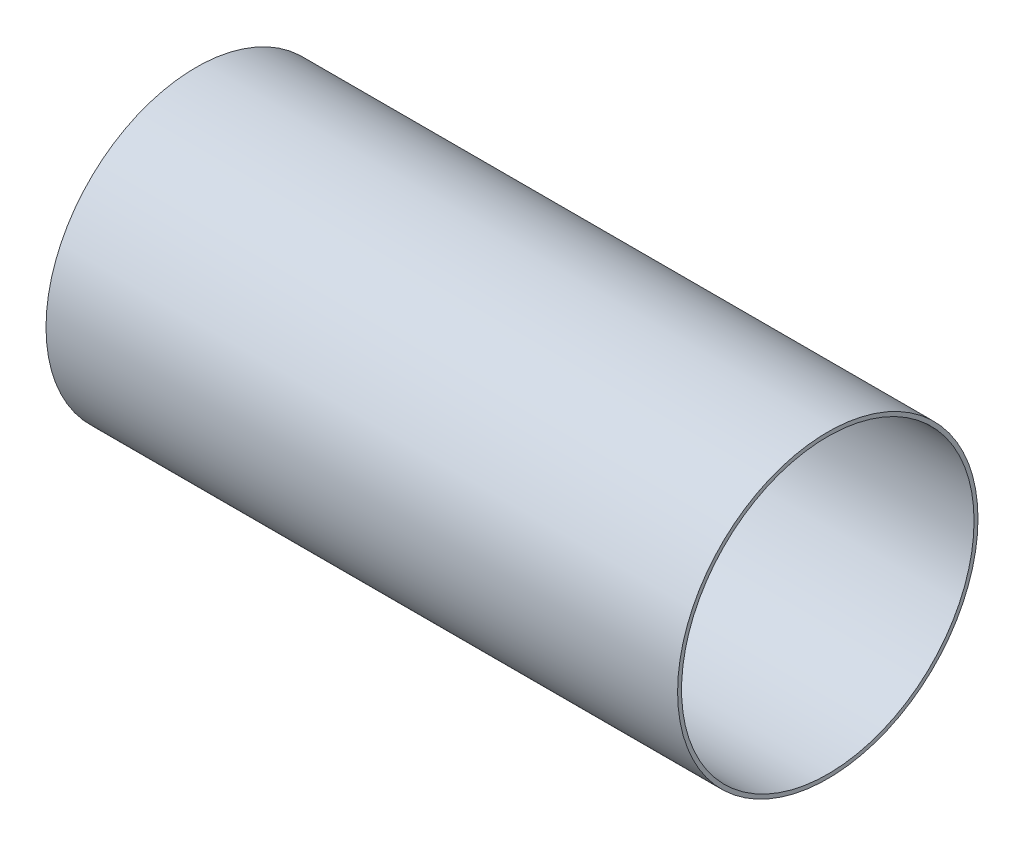
ISO-10303-21;
HEADER;
FILE_DESCRIPTION(('STEP AP214'),'2;1');
FILE_NAME('part.step','',(''),(''),'','','');
FILE_SCHEMA(('AUTOMOTIVE_DESIGN { 1 0 10303 214 1 1 1 1 }'));
ENDSEC;
DATA;
#1=APPLICATION_CONTEXT('core data for automotive mechanical design processes');
#2=APPLICATION_PROTOCOL_DEFINITION('international standard','automotive_design',2000,#1);
#3=PRODUCT_CONTEXT('',#1,'mechanical');
#4=PRODUCT('Part','Part','',(#3));
#5=PRODUCT_RELATED_PRODUCT_CATEGORY('part','',(#4));
#6=PRODUCT_DEFINITION_FORMATION('','',#4);
#7=PRODUCT_DEFINITION_CONTEXT('part definition',#1,'design');
#8=PRODUCT_DEFINITION('design','',#6,#7);
#9=PRODUCT_DEFINITION_SHAPE('','',#8);
#10=(LENGTH_UNIT() NAMED_UNIT(*) SI_UNIT(.MILLI.,.METRE.));
#11=(NAMED_UNIT(*) PLANE_ANGLE_UNIT() SI_UNIT($,.RADIAN.));
#12=(NAMED_UNIT(*) SI_UNIT($,.STERADIAN.) SOLID_ANGLE_UNIT());
#13=UNCERTAINTY_MEASURE_WITH_UNIT(LENGTH_MEASURE(1.E-05),#10,'distance_accuracy_value','');
#14=(GEOMETRIC_REPRESENTATION_CONTEXT(3) GLOBAL_UNCERTAINTY_ASSIGNED_CONTEXT((#13)) GLOBAL_UNIT_ASSIGNED_CONTEXT((#10,
#11,#12)) REPRESENTATION_CONTEXT('',''));
#15=CARTESIAN_POINT('',(0.,0.,0.));
#16=DIRECTION('',(0.,0.,1.));
#17=DIRECTION('',(1.,0.,0.));
#18=AXIS2_PLACEMENT_3D('',#15,#16,#17);
#19=CARTESIAN_POINT('',(320.,0.,0.));
#20=DIRECTION('',(1.,0.,0.));
#21=DIRECTION('',(0.,0.,-1.));
#22=AXIS2_PLACEMENT_3D('',#19,#20,#21);
#23=PLANE('',#22);
#24=CARTESIAN_POINT('',(320.,0.,0.));
#25=DIRECTION('',(1.,0.,0.));
#26=DIRECTION('',(0.,0.,-1.));
#27=AXIS2_PLACEMENT_3D('',#24,#25,#26);
#28=CIRCLE('',#27,76.1);
#29=CARTESIAN_POINT('',(320.,0.,-76.1));
#30=VERTEX_POINT('',#29);
#31=EDGE_CURVE('E10',#30,#30,#28,.T.);
#32=ORIENTED_EDGE('',*,*,#31,.T.);
#33=EDGE_LOOP('',(#32));
#34=FACE_BOUND('',#33,.T.);
#35=CARTESIAN_POINT('',(320.,0.,0.));
#36=DIRECTION('',(1.,0.,0.));
#37=DIRECTION('',(0.,0.,-1.));
#38=AXIS2_PLACEMENT_3D('',#35,#36,#37);
#39=CIRCLE('',#38,74.1);
#40=CARTESIAN_POINT('',(320.,0.,-74.1));
#41=VERTEX_POINT('',#40);
#42=EDGE_CURVE('E43',#41,#41,#39,.T.);
#43=ORIENTED_EDGE('',*,*,#42,.F.);
#44=EDGE_LOOP('',(#43));
#45=FACE_BOUND('',#44,.T.);
#46=ADVANCED_FACE('F32',(#34,#45),#23,.T.);
#47=CARTESIAN_POINT('',(0.,0.,0.));
#48=DIRECTION('',(1.,0.,0.));
#49=DIRECTION('',(0.,0.,-1.));
#50=AXIS2_PLACEMENT_3D('',#47,#48,#49);
#51=PLANE('',#50);
#52=CARTESIAN_POINT('',(0.,0.,0.));
#53=DIRECTION('',(1.,0.,0.));
#54=DIRECTION('',(0.,0.,-1.));
#55=AXIS2_PLACEMENT_3D('',#52,#53,#54);
#56=CIRCLE('',#55,76.1);
#57=CARTESIAN_POINT('',(0.,0.,-76.1));
#58=VERTEX_POINT('',#57);
#59=EDGE_CURVE('E36',#58,#58,#56,.T.);
#60=ORIENTED_EDGE('',*,*,#59,.F.);
#61=EDGE_LOOP('',(#60));
#62=FACE_BOUND('',#61,.T.);
#63=CARTESIAN_POINT('',(0.,0.,0.));
#64=DIRECTION('',(1.,0.,0.));
#65=DIRECTION('',(0.,0.,-1.));
#66=AXIS2_PLACEMENT_3D('',#63,#64,#65);
#67=CIRCLE('',#66,74.1);
#68=CARTESIAN_POINT('',(0.,0.,-74.1));
#69=VERTEX_POINT('',#68);
#70=EDGE_CURVE('E45',#69,#69,#67,.T.);
#71=ORIENTED_EDGE('',*,*,#70,.T.);
#72=EDGE_LOOP('',(#71));
#73=FACE_BOUND('',#72,.T.);
#74=ADVANCED_FACE('F55',(#62,#73),#51,.F.);
#75=CARTESIAN_POINT('',(320.,0.,0.));
#76=DIRECTION('',(-1.,0.,0.));
#77=DIRECTION('',(0.,0.,1.));
#78=AXIS2_PLACEMENT_3D('',#75,#76,#77);
#79=CYLINDRICAL_SURFACE('',#78,76.1);
#80=ORIENTED_EDGE('',*,*,#31,.F.);
#81=EDGE_LOOP('',(#80));
#82=FACE_BOUND('',#81,.T.);
#83=ORIENTED_EDGE('',*,*,#59,.T.);
#84=EDGE_LOOP('',(#83));
#85=FACE_BOUND('',#84,.T.);
#86=ADVANCED_FACE('F34',(#82,#85),#79,.T.);
#87=CARTESIAN_POINT('',(320.,0.,0.));
#88=DIRECTION('',(-1.,0.,0.));
#89=DIRECTION('',(0.,0.,1.));
#90=AXIS2_PLACEMENT_3D('',#87,#88,#89);
#91=CYLINDRICAL_SURFACE('',#90,74.1);
#92=ORIENTED_EDGE('',*,*,#42,.T.);
#93=EDGE_LOOP('',(#92));
#94=FACE_BOUND('',#93,.T.);
#95=ORIENTED_EDGE('',*,*,#70,.F.);
#96=EDGE_LOOP('',(#95));
#97=FACE_BOUND('',#96,.T.);
#98=ADVANCED_FACE('F51',(#94,#97),#91,.F.);
#99=CLOSED_SHELL('',(#46,#74,#86,#98));
#100=MANIFOLD_SOLID_BREP('B2',#99);
#101=ADVANCED_BREP_SHAPE_REPRESENTATION('',(#18,#100),#14);
#102=SHAPE_DEFINITION_REPRESENTATION(#9,#101);
ENDSEC;
END-ISO-10303-21;
